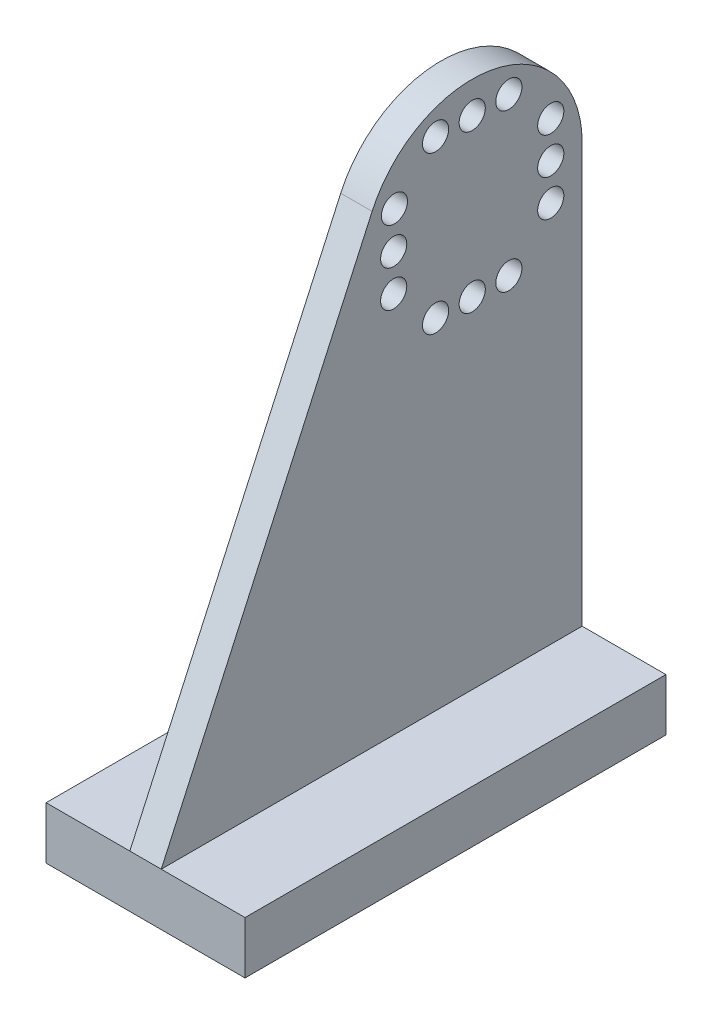
ISO-10303-21;
HEADER;
FILE_DESCRIPTION(('STEP AP214'),'2;1');
FILE_NAME('part.step','',(''),(''),'','','');
FILE_SCHEMA(('AUTOMOTIVE_DESIGN { 1 0 10303 214 1 1 1 1 }'));
ENDSEC;
DATA;
#1=APPLICATION_CONTEXT('core data for automotive mechanical design processes');
#2=APPLICATION_PROTOCOL_DEFINITION('international standard','automotive_design',2000,#1);
#3=PRODUCT_CONTEXT('',#1,'mechanical');
#4=PRODUCT('Part','Part','',(#3));
#5=PRODUCT_RELATED_PRODUCT_CATEGORY('part','',(#4));
#6=PRODUCT_DEFINITION_FORMATION('','',#4);
#7=PRODUCT_DEFINITION_CONTEXT('part definition',#1,'design');
#8=PRODUCT_DEFINITION('design','',#6,#7);
#9=PRODUCT_DEFINITION_SHAPE('','',#8);
#10=(LENGTH_UNIT() NAMED_UNIT(*) SI_UNIT(.MILLI.,.METRE.));
#11=(NAMED_UNIT(*) PLANE_ANGLE_UNIT() SI_UNIT($,.RADIAN.));
#12=(NAMED_UNIT(*) SI_UNIT($,.STERADIAN.) SOLID_ANGLE_UNIT());
#13=UNCERTAINTY_MEASURE_WITH_UNIT(LENGTH_MEASURE(1.E-05),#10,'distance_accuracy_value','');
#14=(GEOMETRIC_REPRESENTATION_CONTEXT(3) GLOBAL_UNCERTAINTY_ASSIGNED_CONTEXT((#13)) GLOBAL_UNIT_ASSIGNED_CONTEXT((#10,
#11,#12)) REPRESENTATION_CONTEXT('',''));
#15=CARTESIAN_POINT('',(0.,0.,0.));
#16=DIRECTION('',(0.,0.,1.));
#17=DIRECTION('',(1.,0.,0.));
#18=AXIS2_PLACEMENT_3D('',#15,#16,#17);
#19=CARTESIAN_POINT('',(6.,0.,0.));
#20=DIRECTION('',(-1.,0.,0.));
#21=DIRECTION('',(0.,0.,-1.));
#22=AXIS2_PLACEMENT_3D('',#19,#20,#21);
#23=PLANE('',#22);
#24=CARTESIAN_POINT('',(6.,7.5,3.5));
#25=DIRECTION('',(1.,0.,0.));
#26=DIRECTION('',(0.,0.,-1.));
#27=AXIS2_PLACEMENT_3D('',#24,#25,#26);
#28=CIRCLE('',#27,1.24999999999941);
#29=CARTESIAN_POINT('',(6.,7.5,2.25000000000058));
#30=VERTEX_POINT('',#29);
#31=EDGE_CURVE('E97',#30,#30,#28,.T.);
#32=ORIENTED_EDGE('',*,*,#31,.F.);
#33=EDGE_LOOP('',(#32));
#34=FACE_BOUND('',#33,.T.);
#35=CARTESIAN_POINT('',(6.,7.5,-3.5));
#36=DIRECTION('',(1.,0.,0.));
#37=DIRECTION('',(0.,0.,-1.));
#38=AXIS2_PLACEMENT_3D('',#35,#36,#37);
#39=CIRCLE('',#38,1.24999999999942);
#40=CARTESIAN_POINT('',(6.,7.5,-4.74999999999942));
#41=VERTEX_POINT('',#40);
#42=EDGE_CURVE('E100',#41,#41,#39,.T.);
#43=ORIENTED_EDGE('',*,*,#42,.F.);
#44=EDGE_LOOP('',(#43));
#45=FACE_BOUND('',#44,.T.);
#46=CARTESIAN_POINT('',(6.,3.5,-7.5));
#47=DIRECTION('',(1.,0.,0.));
#48=DIRECTION('',(0.,0.,-1.));
#49=AXIS2_PLACEMENT_3D('',#46,#47,#48);
#50=CIRCLE('',#49,1.24999999999943);
#51=CARTESIAN_POINT('',(6.,3.5,-8.74999999999943));
#52=VERTEX_POINT('',#51);
#53=EDGE_CURVE('E177',#52,#52,#50,.T.);
#54=ORIENTED_EDGE('',*,*,#53,.F.);
#55=EDGE_LOOP('',(#54));
#56=FACE_BOUND('',#55,.T.);
#57=CARTESIAN_POINT('',(6.,-3.5,-7.5));
#58=DIRECTION('',(1.,0.,0.));
#59=DIRECTION('',(0.,0.,-1.));
#60=AXIS2_PLACEMENT_3D('',#57,#58,#59);
#61=CIRCLE('',#60,1.24999999999945);
#62=CARTESIAN_POINT('',(6.,-3.5,-8.74999999999945));
#63=VERTEX_POINT('',#62);
#64=EDGE_CURVE('E174',#63,#63,#61,.T.);
#65=ORIENTED_EDGE('',*,*,#64,.F.);
#66=EDGE_LOOP('',(#65));
#67=FACE_BOUND('',#66,.T.);
#68=CARTESIAN_POINT('',(6.,-7.5,-3.49999999999999));
#69=DIRECTION('',(1.,0.,0.));
#70=DIRECTION('',(0.,0.,-1.));
#71=AXIS2_PLACEMENT_3D('',#68,#69,#70);
#72=CIRCLE('',#71,1.24999999999946);
#73=CARTESIAN_POINT('',(6.,-7.5,-4.74999999999945));
#74=VERTEX_POINT('',#73);
#75=EDGE_CURVE('E171',#74,#74,#72,.T.);
#76=ORIENTED_EDGE('',*,*,#75,.F.);
#77=EDGE_LOOP('',(#76));
#78=FACE_BOUND('',#77,.T.);
#79=CARTESIAN_POINT('',(6.,-7.5,3.50000000000001));
#80=DIRECTION('',(1.,0.,0.));
#81=DIRECTION('',(0.,0.,-1.));
#82=AXIS2_PLACEMENT_3D('',#79,#80,#81);
#83=CIRCLE('',#82,1.24999999999945);
#84=CARTESIAN_POINT('',(6.,-7.5,2.25000000000056));
#85=VERTEX_POINT('',#84);
#86=EDGE_CURVE('E168',#85,#85,#83,.T.);
#87=ORIENTED_EDGE('',*,*,#86,.F.);
#88=EDGE_LOOP('',(#87));
#89=FACE_BOUND('',#88,.T.);
#90=CARTESIAN_POINT('',(6.,-3.5,7.5));
#91=DIRECTION('',(1.,0.,0.));
#92=DIRECTION('',(0.,0.,-1.));
#93=AXIS2_PLACEMENT_3D('',#90,#91,#92);
#94=CIRCLE('',#93,1.24999999999944);
#95=CARTESIAN_POINT('',(6.,-3.5,6.25000000000056));
#96=VERTEX_POINT('',#95);
#97=EDGE_CURVE('E165',#96,#96,#94,.T.);
#98=ORIENTED_EDGE('',*,*,#97,.F.);
#99=EDGE_LOOP('',(#98));
#100=FACE_BOUND('',#99,.T.);
#101=CARTESIAN_POINT('',(6.,3.49926490451762,7.42827045231363));
#102=DIRECTION('',(1.,0.,0.));
#103=DIRECTION('',(0.,0.,-1.));
#104=AXIS2_PLACEMENT_3D('',#101,#102,#103);
#105=CIRCLE('',#104,1.24999999999942);
#106=CARTESIAN_POINT('',(6.,3.49926490451762,6.1782704523142));
#107=VERTEX_POINT('',#106);
#108=EDGE_CURVE('E162',#107,#107,#105,.T.);
#109=ORIENTED_EDGE('',*,*,#108,.F.);
#110=EDGE_LOOP('',(#109));
#111=FACE_BOUND('',#110,.T.);
#112=CARTESIAN_POINT('',(6.,0.,7.50000000000001));
#113=DIRECTION('',(1.,0.,0.));
#114=DIRECTION('',(0.,0.,-1.));
#115=AXIS2_PLACEMENT_3D('',#112,#113,#114);
#116=CIRCLE('',#115,1.25);
#117=CARTESIAN_POINT('',(6.,0.,6.25000000000001));
#118=VERTEX_POINT('',#117);
#119=EDGE_CURVE('E159',#118,#118,#116,.T.);
#120=ORIENTED_EDGE('',*,*,#119,.F.);
#121=EDGE_LOOP('',(#120));
#122=FACE_BOUND('',#121,.T.);
#123=CARTESIAN_POINT('',(6.,0.,-7.5));
#124=DIRECTION('',(1.,0.,0.));
#125=DIRECTION('',(0.,0.,-1.));
#126=AXIS2_PLACEMENT_3D('',#123,#124,#125);
#127=CIRCLE('',#126,1.25);
#128=CARTESIAN_POINT('',(6.,0.,-8.75));
#129=VERTEX_POINT('',#128);
#130=EDGE_CURVE('E156',#129,#129,#127,.T.);
#131=ORIENTED_EDGE('',*,*,#130,.F.);
#132=EDGE_LOOP('',(#131));
#133=FACE_BOUND('',#132,.T.);
#134=CARTESIAN_POINT('',(6.,-7.5,0.));
#135=DIRECTION('',(1.,0.,0.));
#136=DIRECTION('',(0.,0.,-1.));
#137=AXIS2_PLACEMENT_3D('',#134,#135,#136);
#138=CIRCLE('',#137,1.25);
#139=CARTESIAN_POINT('',(6.,-7.5,-1.24999999999999));
#140=VERTEX_POINT('',#139);
#141=EDGE_CURVE('E153',#140,#140,#138,.T.);
#142=ORIENTED_EDGE('',*,*,#141,.F.);
#143=EDGE_LOOP('',(#142));
#144=FACE_BOUND('',#143,.T.);
#145=CARTESIAN_POINT('',(6.,7.50000000000002,0.));
#146=DIRECTION('',(1.,0.,0.));
#147=DIRECTION('',(0.,0.,-1.));
#148=AXIS2_PLACEMENT_3D('',#145,#146,#147);
#149=CIRCLE('',#148,1.25);
#150=CARTESIAN_POINT('',(6.,7.50000000000002,-1.24999999999999));
#151=VERTEX_POINT('',#150);
#152=EDGE_CURVE('E150',#151,#151,#149,.T.);
#153=ORIENTED_EDGE('',*,*,#152,.F.);
#154=EDGE_LOOP('',(#153));
#155=FACE_BOUND('',#154,.T.);
#156=DIRECTION('',(0.,0.,-1.));
#157=VECTOR('',#156,1.);
#158=CARTESIAN_POINT('',(6.,-40.,-10.5));
#159=LINE('',#158,#157);
#160=CARTESIAN_POINT('',(6.,-40.,29.7));
#161=VERTEX_POINT('',#160);
#162=CARTESIAN_POINT('',(6.,-40.,-10.5));
#163=VERTEX_POINT('',#162);
#164=EDGE_CURVE('E188',#161,#163,#159,.T.);
#165=ORIENTED_EDGE('',*,*,#164,.T.);
#166=DIRECTION('',(0.,-1.,0.));
#167=VECTOR('',#166,1.);
#168=CARTESIAN_POINT('',(6.,0.,-10.5));
#169=LINE('',#168,#167);
#170=CARTESIAN_POINT('',(6.,0.,-10.5));
#171=VERTEX_POINT('',#170);
#172=EDGE_CURVE('E144',#171,#163,#169,.T.);
#173=ORIENTED_EDGE('',*,*,#172,.F.);
#174=CARTESIAN_POINT('',(6.,0.,0.));
#175=DIRECTION('',(1.,0.,0.));
#176=DIRECTION('',(0.,0.,-1.));
#177=AXIS2_PLACEMENT_3D('',#174,#175,#176);
#178=CIRCLE('',#177,10.5);
#179=CARTESIAN_POINT('',(6.,4.34213717238854,9.56011740389006));
#180=VERTEX_POINT('',#179);
#181=EDGE_CURVE('E91',#171,#180,#178,.T.);
#182=ORIENTED_EDGE('',*,*,#181,.T.);
#183=DIRECTION('',(0.,0.910487371799059,-0.413536873560801));
#184=VECTOR('',#183,1.);
#185=CARTESIAN_POINT('',(6.,4.34213717238841,9.56011740389012));
#186=LINE('',#185,#184);
#187=EDGE_CURVE('E147',#161,#180,#186,.T.);
#188=ORIENTED_EDGE('',*,*,#187,.F.);
#189=EDGE_LOOP('',(#165,#173,#182,#188));
#190=FACE_BOUND('',#189,.T.);
#191=ADVANCED_FACE('F34',(#34,#45,#56,#67,#78,#89,#100,#111,#122,#133,#144,#155,#190),#23,.F.);
#192=CARTESIAN_POINT('',(3.,0.,-10.5));
#193=DIRECTION('',(0.,0.,-1.));
#194=DIRECTION('',(1.,0.,0.));
#195=AXIS2_PLACEMENT_3D('',#192,#193,#194);
#196=PLANE('',#195);
#197=ORIENTED_EDGE('',*,*,#172,.T.);
#198=DIRECTION('',(-1.,0.,0.));
#199=VECTOR('',#198,1.);
#200=CARTESIAN_POINT('',(14.,-40.,-10.5));
#201=LINE('',#200,#199);
#202=CARTESIAN_POINT('',(14.,-40.,-10.5));
#203=VERTEX_POINT('',#202);
#204=EDGE_CURVE('E192',#203,#163,#201,.T.);
#205=ORIENTED_EDGE('',*,*,#204,.F.);
#206=DIRECTION('',(0.,-1.,0.));
#207=VECTOR('',#206,1.);
#208=CARTESIAN_POINT('',(14.,-40.,-10.5));
#209=LINE('',#208,#207);
#210=CARTESIAN_POINT('',(14.,-45.,-10.5));
#211=VERTEX_POINT('',#210);
#212=EDGE_CURVE('E223',#203,#211,#209,.T.);
#213=ORIENTED_EDGE('',*,*,#212,.T.);
#214=DIRECTION('',(-1.,0.,0.));
#215=VECTOR('',#214,1.);
#216=CARTESIAN_POINT('',(3.,-45.,-10.5));
#217=LINE('',#216,#215);
#218=CARTESIAN_POINT('',(-5.,-45.,-10.5));
#219=VERTEX_POINT('',#218);
#220=EDGE_CURVE('E103',#211,#219,#217,.T.);
#221=ORIENTED_EDGE('',*,*,#220,.T.);
#222=DIRECTION('',(0.,-1.,0.));
#223=VECTOR('',#222,1.);
#224=CARTESIAN_POINT('',(-5.,-45.,-10.5));
#225=LINE('',#224,#223);
#226=CARTESIAN_POINT('',(-5.,-40.,-10.5));
#227=VERTEX_POINT('',#226);
#228=EDGE_CURVE('E241',#227,#219,#225,.T.);
#229=ORIENTED_EDGE('',*,*,#228,.F.);
#230=DIRECTION('',(1.,0.,0.));
#231=VECTOR('',#230,1.);
#232=CARTESIAN_POINT('',(-5.,-40.,-10.5));
#233=LINE('',#232,#231);
#234=CARTESIAN_POINT('',(3.,-40.,-10.5));
#235=VERTEX_POINT('',#234);
#236=EDGE_CURVE('E96',#227,#235,#233,.T.);
#237=ORIENTED_EDGE('',*,*,#236,.T.);
#238=DIRECTION('',(0.,-1.,0.));
#239=VECTOR('',#238,1.);
#240=CARTESIAN_POINT('',(3.,0.,-10.5));
#241=LINE('',#240,#239);
#242=CARTESIAN_POINT('',(3.,0.,-10.5));
#243=VERTEX_POINT('',#242);
#244=EDGE_CURVE('E83',#243,#235,#241,.T.);
#245=ORIENTED_EDGE('',*,*,#244,.F.);
#246=DIRECTION('',(1.,0.,0.));
#247=VECTOR('',#246,1.);
#248=CARTESIAN_POINT('',(3.,0.,-10.5));
#249=LINE('',#248,#247);
#250=EDGE_CURVE('E11',#243,#171,#249,.T.);
#251=ORIENTED_EDGE('',*,*,#250,.T.);
#252=EDGE_LOOP('',(#197,#205,#213,#221,#229,#237,#245,#251));
#253=FACE_BOUND('',#252,.T.);
#254=ADVANCED_FACE('F36',(#253),#196,.T.);
#255=CARTESIAN_POINT('',(3.,0.,0.));
#256=DIRECTION('',(1.,0.,0.));
#257=DIRECTION('',(0.,0.,1.));
#258=AXIS2_PLACEMENT_3D('',#255,#256,#257);
#259=CYLINDRICAL_SURFACE('',#258,10.5);
#260=ORIENTED_EDGE('',*,*,#181,.F.);
#261=ORIENTED_EDGE('',*,*,#250,.F.);
#262=CARTESIAN_POINT('',(3.,0.,0.));
#263=DIRECTION('',(1.,0.,0.));
#264=DIRECTION('',(0.,0.,-1.));
#265=AXIS2_PLACEMENT_3D('',#262,#263,#264);
#266=CIRCLE('',#265,10.5);
#267=CARTESIAN_POINT('',(3.,4.34213717238854,9.56011740389006));
#268=VERTEX_POINT('',#267);
#269=EDGE_CURVE('E79',#243,#268,#266,.T.);
#270=ORIENTED_EDGE('',*,*,#269,.T.);
#271=DIRECTION('',(1.,0.,0.));
#272=VECTOR('',#271,1.);
#273=CARTESIAN_POINT('',(3.,4.34213717238854,9.56011740389006));
#274=LINE('',#273,#272);
#275=EDGE_CURVE('E43',#268,#180,#274,.T.);
#276=ORIENTED_EDGE('',*,*,#275,.T.);
#277=EDGE_LOOP('',(#260,#261,#270,#276));
#278=FACE_BOUND('',#277,.T.);
#279=ADVANCED_FACE('F89',(#278),#259,.T.);
#280=CARTESIAN_POINT('',(3.,4.34213717238841,9.56011740389012));
#281=DIRECTION('',(0.,0.413536873560801,0.910487371799059));
#282=DIRECTION('',(0.,-0.910487371799059,0.413536873560801));
#283=AXIS2_PLACEMENT_3D('',#280,#281,#282);
#284=PLANE('',#283);
#285=ORIENTED_EDGE('',*,*,#187,.T.);
#286=ORIENTED_EDGE('',*,*,#275,.F.);
#287=DIRECTION('',(0.,0.910487371799059,-0.413536873560801));
#288=VECTOR('',#287,1.);
#289=CARTESIAN_POINT('',(3.,4.34213717238841,9.56011740389012));
#290=LINE('',#289,#288);
#291=CARTESIAN_POINT('',(3.,-40.,29.7));
#292=VERTEX_POINT('',#291);
#293=EDGE_CURVE('E85',#292,#268,#290,.T.);
#294=ORIENTED_EDGE('',*,*,#293,.F.);
#295=DIRECTION('',(1.,0.,0.));
#296=VECTOR('',#295,1.);
#297=CARTESIAN_POINT('',(3.,-40.,29.7));
#298=LINE('',#297,#296);
#299=EDGE_CURVE('E143',#292,#161,#298,.T.);
#300=ORIENTED_EDGE('',*,*,#299,.T.);
#301=EDGE_LOOP('',(#285,#286,#294,#300));
#302=FACE_BOUND('',#301,.T.);
#303=ADVANCED_FACE('F184',(#302),#284,.T.);
#304=CARTESIAN_POINT('',(3.,7.5,-3.5));
#305=DIRECTION('',(1.,0.,0.));
#306=DIRECTION('',(0.,0.,1.));
#307=AXIS2_PLACEMENT_3D('',#304,#305,#306);
#308=CYLINDRICAL_SURFACE('',#307,1.24999999999942);
#309=CARTESIAN_POINT('',(3.,7.5,-3.5));
#310=DIRECTION('',(1.,0.,0.));
#311=DIRECTION('',(0.,0.,-1.));
#312=AXIS2_PLACEMENT_3D('',#309,#310,#311);
#313=CIRCLE('',#312,1.24999999999942);
#314=CARTESIAN_POINT('',(3.,7.5,-4.74999999999942));
#315=VERTEX_POINT('',#314);
#316=EDGE_CURVE('E137',#315,#315,#313,.T.);
#317=ORIENTED_EDGE('',*,*,#316,.F.);
#318=EDGE_LOOP('',(#317));
#319=FACE_BOUND('',#318,.T.);
#320=ORIENTED_EDGE('',*,*,#42,.T.);
#321=EDGE_LOOP('',(#320));
#322=FACE_BOUND('',#321,.T.);
#323=ADVANCED_FACE('F291',(#319,#322),#308,.F.);
#324=CARTESIAN_POINT('',(3.,3.5,-7.5));
#325=DIRECTION('',(1.,0.,0.));
#326=DIRECTION('',(0.,0.,1.));
#327=AXIS2_PLACEMENT_3D('',#324,#325,#326);
#328=CYLINDRICAL_SURFACE('',#327,1.24999999999943);
#329=CARTESIAN_POINT('',(3.,3.5,-7.5));
#330=DIRECTION('',(1.,0.,0.));
#331=DIRECTION('',(0.,0.,-1.));
#332=AXIS2_PLACEMENT_3D('',#329,#330,#331);
#333=CIRCLE('',#332,1.24999999999943);
#334=CARTESIAN_POINT('',(3.,3.5,-8.74999999999943));
#335=VERTEX_POINT('',#334);
#336=EDGE_CURVE('E134',#335,#335,#333,.T.);
#337=ORIENTED_EDGE('',*,*,#336,.F.);
#338=EDGE_LOOP('',(#337));
#339=FACE_BOUND('',#338,.T.);
#340=ORIENTED_EDGE('',*,*,#53,.T.);
#341=EDGE_LOOP('',(#340));
#342=FACE_BOUND('',#341,.T.);
#343=ADVANCED_FACE('F294',(#339,#342),#328,.F.);
#344=CARTESIAN_POINT('',(3.,-3.5,-7.5));
#345=DIRECTION('',(1.,0.,0.));
#346=DIRECTION('',(0.,0.,1.));
#347=AXIS2_PLACEMENT_3D('',#344,#345,#346);
#348=CYLINDRICAL_SURFACE('',#347,1.24999999999945);
#349=CARTESIAN_POINT('',(3.,-3.5,-7.5));
#350=DIRECTION('',(1.,0.,0.));
#351=DIRECTION('',(0.,0.,-1.));
#352=AXIS2_PLACEMENT_3D('',#349,#350,#351);
#353=CIRCLE('',#352,1.24999999999945);
#354=CARTESIAN_POINT('',(3.,-3.5,-8.74999999999945));
#355=VERTEX_POINT('',#354);
#356=EDGE_CURVE('E131',#355,#355,#353,.T.);
#357=ORIENTED_EDGE('',*,*,#356,.F.);
#358=EDGE_LOOP('',(#357));
#359=FACE_BOUND('',#358,.T.);
#360=ORIENTED_EDGE('',*,*,#64,.T.);
#361=EDGE_LOOP('',(#360));
#362=FACE_BOUND('',#361,.T.);
#363=ADVANCED_FACE('F298',(#359,#362),#348,.F.);
#364=CARTESIAN_POINT('',(3.,-7.5,-3.49999999999999));
#365=DIRECTION('',(1.,0.,0.));
#366=DIRECTION('',(0.,0.,1.));
#367=AXIS2_PLACEMENT_3D('',#364,#365,#366);
#368=CYLINDRICAL_SURFACE('',#367,1.24999999999946);
#369=CARTESIAN_POINT('',(3.,-7.5,-3.49999999999999));
#370=DIRECTION('',(1.,0.,0.));
#371=DIRECTION('',(0.,0.,-1.));
#372=AXIS2_PLACEMENT_3D('',#369,#370,#371);
#373=CIRCLE('',#372,1.24999999999946);
#374=CARTESIAN_POINT('',(3.,-7.5,-4.74999999999945));
#375=VERTEX_POINT('',#374);
#376=EDGE_CURVE('E128',#375,#375,#373,.T.);
#377=ORIENTED_EDGE('',*,*,#376,.F.);
#378=EDGE_LOOP('',(#377));
#379=FACE_BOUND('',#378,.T.);
#380=ORIENTED_EDGE('',*,*,#75,.T.);
#381=EDGE_LOOP('',(#380));
#382=FACE_BOUND('',#381,.T.);
#383=ADVANCED_FACE('F302',(#379,#382),#368,.F.);
#384=CARTESIAN_POINT('',(3.,-7.5,3.50000000000001));
#385=DIRECTION('',(1.,0.,0.));
#386=DIRECTION('',(0.,0.,1.));
#387=AXIS2_PLACEMENT_3D('',#384,#385,#386);
#388=CYLINDRICAL_SURFACE('',#387,1.24999999999945);
#389=CARTESIAN_POINT('',(3.,-7.5,3.50000000000001));
#390=DIRECTION('',(1.,0.,0.));
#391=DIRECTION('',(0.,0.,-1.));
#392=AXIS2_PLACEMENT_3D('',#389,#390,#391);
#393=CIRCLE('',#392,1.24999999999945);
#394=CARTESIAN_POINT('',(3.,-7.5,2.25000000000056));
#395=VERTEX_POINT('',#394);
#396=EDGE_CURVE('E125',#395,#395,#393,.T.);
#397=ORIENTED_EDGE('',*,*,#396,.F.);
#398=EDGE_LOOP('',(#397));
#399=FACE_BOUND('',#398,.T.);
#400=ORIENTED_EDGE('',*,*,#86,.T.);
#401=EDGE_LOOP('',(#400));
#402=FACE_BOUND('',#401,.T.);
#403=ADVANCED_FACE('F306',(#399,#402),#388,.F.);
#404=CARTESIAN_POINT('',(3.,-3.5,7.5));
#405=DIRECTION('',(1.,0.,0.));
#406=DIRECTION('',(0.,0.,1.));
#407=AXIS2_PLACEMENT_3D('',#404,#405,#406);
#408=CYLINDRICAL_SURFACE('',#407,1.24999999999944);
#409=CARTESIAN_POINT('',(3.,-3.5,7.5));
#410=DIRECTION('',(1.,0.,0.));
#411=DIRECTION('',(0.,0.,-1.));
#412=AXIS2_PLACEMENT_3D('',#409,#410,#411);
#413=CIRCLE('',#412,1.24999999999944);
#414=CARTESIAN_POINT('',(3.,-3.5,6.25000000000056));
#415=VERTEX_POINT('',#414);
#416=EDGE_CURVE('E122',#415,#415,#413,.T.);
#417=ORIENTED_EDGE('',*,*,#416,.F.);
#418=EDGE_LOOP('',(#417));
#419=FACE_BOUND('',#418,.T.);
#420=ORIENTED_EDGE('',*,*,#97,.T.);
#421=EDGE_LOOP('',(#420));
#422=FACE_BOUND('',#421,.T.);
#423=ADVANCED_FACE('F310',(#419,#422),#408,.F.);
#424=CARTESIAN_POINT('',(3.,3.49926490451762,7.42827045231363));
#425=DIRECTION('',(1.,0.,0.));
#426=DIRECTION('',(0.,0.,1.));
#427=AXIS2_PLACEMENT_3D('',#424,#425,#426);
#428=CYLINDRICAL_SURFACE('',#427,1.24999999999942);
#429=CARTESIAN_POINT('',(3.,3.49926490451762,7.42827045231363));
#430=DIRECTION('',(1.,0.,0.));
#431=DIRECTION('',(0.,0.,-1.));
#432=AXIS2_PLACEMENT_3D('',#429,#430,#431);
#433=CIRCLE('',#432,1.24999999999942);
#434=CARTESIAN_POINT('',(3.,3.49926490451762,6.1782704523142));
#435=VERTEX_POINT('',#434);
#436=EDGE_CURVE('E119',#435,#435,#433,.T.);
#437=ORIENTED_EDGE('',*,*,#436,.F.);
#438=EDGE_LOOP('',(#437));
#439=FACE_BOUND('',#438,.T.);
#440=ORIENTED_EDGE('',*,*,#108,.T.);
#441=EDGE_LOOP('',(#440));
#442=FACE_BOUND('',#441,.T.);
#443=ADVANCED_FACE('F314',(#439,#442),#428,.F.);
#444=CARTESIAN_POINT('',(3.,0.,7.50000000000001));
#445=DIRECTION('',(1.,0.,0.));
#446=DIRECTION('',(0.,0.,1.));
#447=AXIS2_PLACEMENT_3D('',#444,#445,#446);
#448=CYLINDRICAL_SURFACE('',#447,1.25);
#449=CARTESIAN_POINT('',(3.,0.,7.50000000000001));
#450=DIRECTION('',(1.,0.,0.));
#451=DIRECTION('',(0.,0.,-1.));
#452=AXIS2_PLACEMENT_3D('',#449,#450,#451);
#453=CIRCLE('',#452,1.25);
#454=CARTESIAN_POINT('',(3.,0.,6.25000000000001));
#455=VERTEX_POINT('',#454);
#456=EDGE_CURVE('E116',#455,#455,#453,.T.);
#457=ORIENTED_EDGE('',*,*,#456,.F.);
#458=EDGE_LOOP('',(#457));
#459=FACE_BOUND('',#458,.T.);
#460=ORIENTED_EDGE('',*,*,#119,.T.);
#461=EDGE_LOOP('',(#460));
#462=FACE_BOUND('',#461,.T.);
#463=ADVANCED_FACE('F318',(#459,#462),#448,.F.);
#464=CARTESIAN_POINT('',(3.,0.,-7.5));
#465=DIRECTION('',(1.,0.,0.));
#466=DIRECTION('',(0.,0.,1.));
#467=AXIS2_PLACEMENT_3D('',#464,#465,#466);
#468=CYLINDRICAL_SURFACE('',#467,1.25);
#469=CARTESIAN_POINT('',(3.,0.,-7.5));
#470=DIRECTION('',(1.,0.,0.));
#471=DIRECTION('',(0.,0.,-1.));
#472=AXIS2_PLACEMENT_3D('',#469,#470,#471);
#473=CIRCLE('',#472,1.25);
#474=CARTESIAN_POINT('',(3.,0.,-8.75));
#475=VERTEX_POINT('',#474);
#476=EDGE_CURVE('E113',#475,#475,#473,.T.);
#477=ORIENTED_EDGE('',*,*,#476,.F.);
#478=EDGE_LOOP('',(#477));
#479=FACE_BOUND('',#478,.T.);
#480=ORIENTED_EDGE('',*,*,#130,.T.);
#481=EDGE_LOOP('',(#480));
#482=FACE_BOUND('',#481,.T.);
#483=ADVANCED_FACE('F322',(#479,#482),#468,.F.);
#484=CARTESIAN_POINT('',(3.,-7.5,0.));
#485=DIRECTION('',(1.,0.,0.));
#486=DIRECTION('',(0.,0.,1.));
#487=AXIS2_PLACEMENT_3D('',#484,#485,#486);
#488=CYLINDRICAL_SURFACE('',#487,1.25);
#489=CARTESIAN_POINT('',(3.,-7.5,0.));
#490=DIRECTION('',(1.,0.,0.));
#491=DIRECTION('',(0.,0.,-1.));
#492=AXIS2_PLACEMENT_3D('',#489,#490,#491);
#493=CIRCLE('',#492,1.25);
#494=CARTESIAN_POINT('',(3.,-7.5,-1.24999999999999));
#495=VERTEX_POINT('',#494);
#496=EDGE_CURVE('E110',#495,#495,#493,.T.);
#497=ORIENTED_EDGE('',*,*,#496,.F.);
#498=EDGE_LOOP('',(#497));
#499=FACE_BOUND('',#498,.T.);
#500=ORIENTED_EDGE('',*,*,#141,.T.);
#501=EDGE_LOOP('',(#500));
#502=FACE_BOUND('',#501,.T.);
#503=ADVANCED_FACE('F326',(#499,#502),#488,.F.);
#504=CARTESIAN_POINT('',(3.,7.50000000000002,0.));
#505=DIRECTION('',(1.,0.,0.));
#506=DIRECTION('',(0.,0.,1.));
#507=AXIS2_PLACEMENT_3D('',#504,#505,#506);
#508=CYLINDRICAL_SURFACE('',#507,1.25);
#509=CARTESIAN_POINT('',(3.,7.50000000000002,0.));
#510=DIRECTION('',(1.,0.,0.));
#511=DIRECTION('',(0.,0.,-1.));
#512=AXIS2_PLACEMENT_3D('',#509,#510,#511);
#513=CIRCLE('',#512,1.25);
#514=CARTESIAN_POINT('',(3.,7.50000000000002,-1.24999999999999));
#515=VERTEX_POINT('',#514);
#516=EDGE_CURVE('E107',#515,#515,#513,.T.);
#517=ORIENTED_EDGE('',*,*,#516,.F.);
#518=EDGE_LOOP('',(#517));
#519=FACE_BOUND('',#518,.T.);
#520=ORIENTED_EDGE('',*,*,#152,.T.);
#521=EDGE_LOOP('',(#520));
#522=FACE_BOUND('',#521,.T.);
#523=ADVANCED_FACE('F289',(#519,#522),#508,.F.);
#524=CARTESIAN_POINT('',(3.,7.5,3.5));
#525=DIRECTION('',(1.,0.,0.));
#526=DIRECTION('',(0.,0.,1.));
#527=AXIS2_PLACEMENT_3D('',#524,#525,#526);
#528=CYLINDRICAL_SURFACE('',#527,1.24999999999941);
#529=CARTESIAN_POINT('',(3.,7.5,3.5));
#530=DIRECTION('',(1.,0.,0.));
#531=DIRECTION('',(0.,0.,-1.));
#532=AXIS2_PLACEMENT_3D('',#529,#530,#531);
#533=CIRCLE('',#532,1.24999999999941);
#534=CARTESIAN_POINT('',(3.,7.5,2.25000000000058));
#535=VERTEX_POINT('',#534);
#536=EDGE_CURVE('E140',#535,#535,#533,.T.);
#537=ORIENTED_EDGE('',*,*,#536,.F.);
#538=EDGE_LOOP('',(#537));
#539=FACE_BOUND('',#538,.T.);
#540=ORIENTED_EDGE('',*,*,#31,.T.);
#541=EDGE_LOOP('',(#540));
#542=FACE_BOUND('',#541,.T.);
#543=ADVANCED_FACE('F286',(#539,#542),#528,.F.);
#544=CARTESIAN_POINT('',(3.,0.,0.));
#545=DIRECTION('',(-1.,0.,0.));
#546=DIRECTION('',(0.,0.,-1.));
#547=AXIS2_PLACEMENT_3D('',#544,#545,#546);
#548=PLANE('',#547);
#549=DIRECTION('',(0.,0.,-1.));
#550=VECTOR('',#549,1.);
#551=CARTESIAN_POINT('',(3.,-40.,-10.5));
#552=LINE('',#551,#550);
#553=EDGE_CURVE('E51',#292,#235,#552,.T.);
#554=ORIENTED_EDGE('',*,*,#553,.F.);
#555=ORIENTED_EDGE('',*,*,#293,.T.);
#556=ORIENTED_EDGE('',*,*,#269,.F.);
#557=ORIENTED_EDGE('',*,*,#244,.T.);
#558=EDGE_LOOP('',(#554,#555,#556,#557));
#559=FACE_BOUND('',#558,.T.);
#560=ORIENTED_EDGE('',*,*,#516,.T.);
#561=EDGE_LOOP('',(#560));
#562=FACE_BOUND('',#561,.T.);
#563=ORIENTED_EDGE('',*,*,#496,.T.);
#564=EDGE_LOOP('',(#563));
#565=FACE_BOUND('',#564,.T.);
#566=ORIENTED_EDGE('',*,*,#476,.T.);
#567=EDGE_LOOP('',(#566));
#568=FACE_BOUND('',#567,.T.);
#569=ORIENTED_EDGE('',*,*,#456,.T.);
#570=EDGE_LOOP('',(#569));
#571=FACE_BOUND('',#570,.T.);
#572=ORIENTED_EDGE('',*,*,#436,.T.);
#573=EDGE_LOOP('',(#572));
#574=FACE_BOUND('',#573,.T.);
#575=ORIENTED_EDGE('',*,*,#416,.T.);
#576=EDGE_LOOP('',(#575));
#577=FACE_BOUND('',#576,.T.);
#578=ORIENTED_EDGE('',*,*,#396,.T.);
#579=EDGE_LOOP('',(#578));
#580=FACE_BOUND('',#579,.T.);
#581=ORIENTED_EDGE('',*,*,#376,.T.);
#582=EDGE_LOOP('',(#581));
#583=FACE_BOUND('',#582,.T.);
#584=ORIENTED_EDGE('',*,*,#356,.T.);
#585=EDGE_LOOP('',(#584));
#586=FACE_BOUND('',#585,.T.);
#587=ORIENTED_EDGE('',*,*,#336,.T.);
#588=EDGE_LOOP('',(#587));
#589=FACE_BOUND('',#588,.T.);
#590=ORIENTED_EDGE('',*,*,#316,.T.);
#591=EDGE_LOOP('',(#590));
#592=FACE_BOUND('',#591,.T.);
#593=ORIENTED_EDGE('',*,*,#536,.T.);
#594=EDGE_LOOP('',(#593));
#595=FACE_BOUND('',#594,.T.);
#596=ADVANCED_FACE('F80',(#559,#562,#565,#568,#571,#574,#577,#580,#583,#586,#589,#592,#595),
#548,.T.);
#597=CARTESIAN_POINT('',(3.,-45.,29.7));
#598=DIRECTION('',(0.,0.,-1.));
#599=DIRECTION('',(1.,0.,0.));
#600=AXIS2_PLACEMENT_3D('',#597,#598,#599);
#601=PLANE('',#600);
#602=ORIENTED_EDGE('',*,*,#299,.F.);
#603=DIRECTION('',(1.,0.,0.));
#604=VECTOR('',#603,1.);
#605=CARTESIAN_POINT('',(-5.,-40.,29.7));
#606=LINE('',#605,#604);
#607=CARTESIAN_POINT('',(-5.,-40.,29.7));
#608=VERTEX_POINT('',#607);
#609=EDGE_CURVE('E237',#608,#292,#606,.T.);
#610=ORIENTED_EDGE('',*,*,#609,.F.);
#611=DIRECTION('',(0.,1.,0.));
#612=VECTOR('',#611,1.);
#613=CARTESIAN_POINT('',(-5.,-45.,29.7));
#614=LINE('',#613,#612);
#615=CARTESIAN_POINT('',(-5.,-45.,29.7));
#616=VERTEX_POINT('',#615);
#617=EDGE_CURVE('E247',#616,#608,#614,.T.);
#618=ORIENTED_EDGE('',*,*,#617,.F.);
#619=DIRECTION('',(1.,0.,0.));
#620=VECTOR('',#619,1.);
#621=CARTESIAN_POINT('',(3.,-45.,29.7));
#622=LINE('',#621,#620);
#623=CARTESIAN_POINT('',(14.,-45.,29.7));
#624=VERTEX_POINT('',#623);
#625=EDGE_CURVE('E226',#616,#624,#622,.T.);
#626=ORIENTED_EDGE('',*,*,#625,.T.);
#627=DIRECTION('',(0.,1.,0.));
#628=VECTOR('',#627,1.);
#629=CARTESIAN_POINT('',(14.,-40.,29.7));
#630=LINE('',#629,#628);
#631=CARTESIAN_POINT('',(14.,-40.,29.7));
#632=VERTEX_POINT('',#631);
#633=EDGE_CURVE('E221',#624,#632,#630,.T.);
#634=ORIENTED_EDGE('',*,*,#633,.T.);
#635=DIRECTION('',(-1.,0.,0.));
#636=VECTOR('',#635,1.);
#637=CARTESIAN_POINT('',(14.,-40.,29.7));
#638=LINE('',#637,#636);
#639=EDGE_CURVE('E70',#632,#161,#638,.T.);
#640=ORIENTED_EDGE('',*,*,#639,.T.);
#641=EDGE_LOOP('',(#602,#610,#618,#626,#634,#640));
#642=FACE_BOUND('',#641,.T.);
#643=ADVANCED_FACE('F228',(#642),#601,.F.);
#644=CARTESIAN_POINT('',(6.,-45.,0.));
#645=DIRECTION('',(0.,-1.,0.));
#646=DIRECTION('',(0.,0.,-1.));
#647=AXIS2_PLACEMENT_3D('',#644,#645,#646);
#648=PLANE('',#647);
#649=CARTESIAN_POINT('',(-1.,-45.,19.7));
#650=DIRECTION('',(0.,-1.,0.));
#651=DIRECTION('',(0.,0.,-1.));
#652=AXIS2_PLACEMENT_3D('',#649,#650,#651);
#653=CIRCLE('',#652,1.25);
#654=CARTESIAN_POINT('',(-1.,-45.,18.45));
#655=VERTEX_POINT('',#654);
#656=EDGE_CURVE('E475',#655,#655,#653,.T.);
#657=ORIENTED_EDGE('',*,*,#656,.F.);
#658=EDGE_LOOP('',(#657));
#659=FACE_BOUND('',#658,.T.);
#660=CARTESIAN_POINT('',(-1.,-45.,-0.500000000000002));
#661=DIRECTION('',(0.,-1.,0.));
#662=DIRECTION('',(0.,0.,-1.));
#663=AXIS2_PLACEMENT_3D('',#660,#661,#662);
#664=CIRCLE('',#663,1.25);
#665=CARTESIAN_POINT('',(-1.,-45.,-1.75));
#666=VERTEX_POINT('',#665);
#667=EDGE_CURVE('E251',#666,#666,#664,.T.);
#668=ORIENTED_EDGE('',*,*,#667,.F.);
#669=EDGE_LOOP('',(#668));
#670=FACE_BOUND('',#669,.T.);
#671=ORIENTED_EDGE('',*,*,#625,.F.);
#672=DIRECTION('',(0.,0.,1.));
#673=VECTOR('',#672,1.);
#674=CARTESIAN_POINT('',(-5.,-45.,-10.5));
#675=LINE('',#674,#673);
#676=EDGE_CURVE('E245',#219,#616,#675,.T.);
#677=ORIENTED_EDGE('',*,*,#676,.F.);
#678=ORIENTED_EDGE('',*,*,#220,.F.);
#679=DIRECTION('',(0.,0.,1.));
#680=VECTOR('',#679,1.);
#681=CARTESIAN_POINT('',(14.,-45.,-10.5));
#682=LINE('',#681,#680);
#683=EDGE_CURVE('E231',#211,#624,#682,.T.);
#684=ORIENTED_EDGE('',*,*,#683,.T.);
#685=EDGE_LOOP('',(#671,#677,#678,#684));
#686=FACE_BOUND('',#685,.T.);
#687=ADVANCED_FACE('F246',(#659,#670,#686),#648,.T.);
#688=CARTESIAN_POINT('',(14.,-40.,-10.5));
#689=DIRECTION('',(0.,-1.,0.));
#690=DIRECTION('',(0.,0.,-1.));
#691=AXIS2_PLACEMENT_3D('',#688,#689,#690);
#692=PLANE('',#691);
#693=ORIENTED_EDGE('',*,*,#164,.F.);
#694=ORIENTED_EDGE('',*,*,#639,.F.);
#695=DIRECTION('',(0.,0.,-1.));
#696=VECTOR('',#695,1.);
#697=CARTESIAN_POINT('',(14.,-40.,-10.5));
#698=LINE('',#697,#696);
#699=EDGE_CURVE('E219',#632,#203,#698,.T.);
#700=ORIENTED_EDGE('',*,*,#699,.T.);
#701=ORIENTED_EDGE('',*,*,#204,.T.);
#702=EDGE_LOOP('',(#693,#694,#700,#701));
#703=FACE_BOUND('',#702,.T.);
#704=ADVANCED_FACE('F225',(#703),#692,.F.);
#705=CARTESIAN_POINT('',(14.,0.,0.));
#706=DIRECTION('',(1.,0.,0.));
#707=DIRECTION('',(0.,0.,1.));
#708=AXIS2_PLACEMENT_3D('',#705,#706,#707);
#709=PLANE('',#708);
#710=ORIENTED_EDGE('',*,*,#212,.F.);
#711=ORIENTED_EDGE('',*,*,#699,.F.);
#712=ORIENTED_EDGE('',*,*,#633,.F.);
#713=ORIENTED_EDGE('',*,*,#683,.F.);
#714=EDGE_LOOP('',(#710,#711,#712,#713));
#715=FACE_BOUND('',#714,.T.);
#716=ADVANCED_FACE('F220',(#715),#709,.T.);
#717=CARTESIAN_POINT('',(-5.,-40.,-10.5));
#718=DIRECTION('',(0.,-1.,0.));
#719=DIRECTION('',(0.,0.,-1.));
#720=AXIS2_PLACEMENT_3D('',#717,#718,#719);
#721=PLANE('',#720);
#722=CARTESIAN_POINT('',(-1.,-40.,19.7));
#723=DIRECTION('',(0.,1.,0.));
#724=DIRECTION('',(0.,0.,1.));
#725=AXIS2_PLACEMENT_3D('',#722,#723,#724);
#726=CIRCLE('',#725,1.25);
#727=CARTESIAN_POINT('',(-1.,-40.,20.95));
#728=VERTEX_POINT('',#727);
#729=EDGE_CURVE('E477',#728,#728,#726,.T.);
#730=ORIENTED_EDGE('',*,*,#729,.F.);
#731=EDGE_LOOP('',(#730));
#732=FACE_BOUND('',#731,.T.);
#733=CARTESIAN_POINT('',(-1.,-40.,-0.500000000000002));
#734=DIRECTION('',(0.,1.,0.));
#735=DIRECTION('',(0.,0.,1.));
#736=AXIS2_PLACEMENT_3D('',#733,#734,#735);
#737=CIRCLE('',#736,1.25);
#738=CARTESIAN_POINT('',(-1.,-40.,0.749999999999998));
#739=VERTEX_POINT('',#738);
#740=EDGE_CURVE('E479',#739,#739,#737,.T.);
#741=ORIENTED_EDGE('',*,*,#740,.F.);
#742=EDGE_LOOP('',(#741));
#743=FACE_BOUND('',#742,.T.);
#744=ORIENTED_EDGE('',*,*,#553,.T.);
#745=ORIENTED_EDGE('',*,*,#236,.F.);
#746=DIRECTION('',(0.,0.,-1.));
#747=VECTOR('',#746,1.);
#748=CARTESIAN_POINT('',(-5.,-40.,-10.5));
#749=LINE('',#748,#747);
#750=EDGE_CURVE('E206',#608,#227,#749,.T.);
#751=ORIENTED_EDGE('',*,*,#750,.F.);
#752=ORIENTED_EDGE('',*,*,#609,.T.);
#753=EDGE_LOOP('',(#744,#745,#751,#752));
#754=FACE_BOUND('',#753,.T.);
#755=ADVANCED_FACE('F262',(#732,#743,#754),#721,.F.);
#756=CARTESIAN_POINT('',(-5.,0.,0.));
#757=DIRECTION('',(1.,0.,0.));
#758=DIRECTION('',(0.,0.,-1.));
#759=AXIS2_PLACEMENT_3D('',#756,#757,#758);
#760=PLANE('',#759);
#761=ORIENTED_EDGE('',*,*,#228,.T.);
#762=ORIENTED_EDGE('',*,*,#676,.T.);
#763=ORIENTED_EDGE('',*,*,#617,.T.);
#764=ORIENTED_EDGE('',*,*,#750,.T.);
#765=EDGE_LOOP('',(#761,#762,#763,#764));
#766=FACE_BOUND('',#765,.T.);
#767=ADVANCED_FACE('F249',(#766),#760,.F.);
#768=CARTESIAN_POINT('',(-1.,-48.,-0.500000000000002));
#769=DIRECTION('',(0.,1.,0.));
#770=DIRECTION('',(0.,0.,1.));
#771=AXIS2_PLACEMENT_3D('',#768,#769,#770);
#772=CYLINDRICAL_SURFACE('',#771,1.25);
#773=ORIENTED_EDGE('',*,*,#667,.T.);
#774=EDGE_LOOP('',(#773));
#775=FACE_BOUND('',#774,.T.);
#776=ORIENTED_EDGE('',*,*,#740,.T.);
#777=EDGE_LOOP('',(#776));
#778=FACE_BOUND('',#777,.T.);
#779=ADVANCED_FACE('F270',(#775,#778),#772,.F.);
#780=CARTESIAN_POINT('',(-1.,-48.,19.7));
#781=DIRECTION('',(0.,1.,0.));
#782=DIRECTION('',(0.,0.,1.));
#783=AXIS2_PLACEMENT_3D('',#780,#781,#782);
#784=CYLINDRICAL_SURFACE('',#783,1.25);
#785=ORIENTED_EDGE('',*,*,#656,.T.);
#786=EDGE_LOOP('',(#785));
#787=FACE_BOUND('',#786,.T.);
#788=ORIENTED_EDGE('',*,*,#729,.T.);
#789=EDGE_LOOP('',(#788));
#790=FACE_BOUND('',#789,.T.);
#791=ADVANCED_FACE('F458',(#787,#790),#784,.F.);
#792=CLOSED_SHELL('',(#191,#254,#279,#303,#323,#343,#363,#383,#403,#423,#443,#463,#483,#503,
#523,#543,#596,#643,#687,#704,#716,#755,#767,#779,#791));
#793=MANIFOLD_SOLID_BREP('B2',#792);
#794=ADVANCED_BREP_SHAPE_REPRESENTATION('',(#18,#793),#14);
#795=SHAPE_DEFINITION_REPRESENTATION(#9,#794);
ENDSEC;
END-ISO-10303-21;
